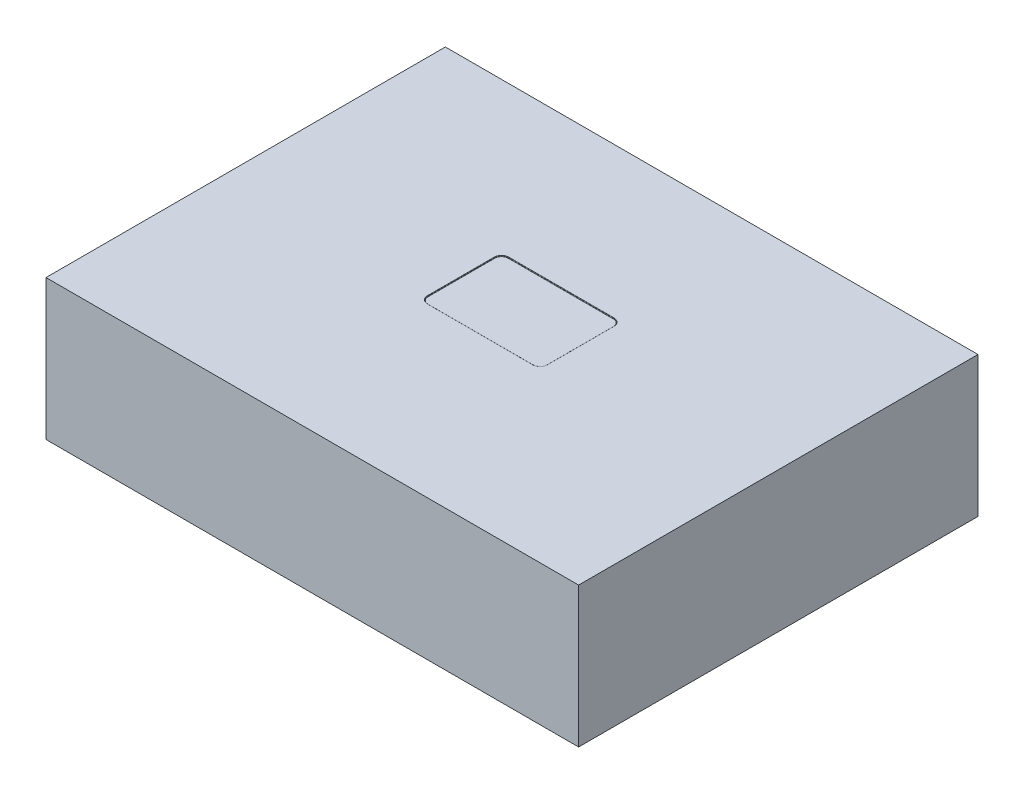
ISO-10303-21;
HEADER;
FILE_DESCRIPTION(('STEP AP214'),'2;1');
FILE_NAME('part.step','',(''),(''),'','','');
FILE_SCHEMA(('AUTOMOTIVE_DESIGN { 1 0 10303 214 1 1 1 1 }'));
ENDSEC;
DATA;
#1=APPLICATION_CONTEXT('core data for automotive mechanical design processes');
#2=APPLICATION_PROTOCOL_DEFINITION('international standard','automotive_design',2000,#1);
#3=PRODUCT_CONTEXT('',#1,'mechanical');
#4=PRODUCT('Part','Part','',(#3));
#5=PRODUCT_RELATED_PRODUCT_CATEGORY('part','',(#4));
#6=PRODUCT_DEFINITION_FORMATION('','',#4);
#7=PRODUCT_DEFINITION_CONTEXT('part definition',#1,'design');
#8=PRODUCT_DEFINITION('design','',#6,#7);
#9=PRODUCT_DEFINITION_SHAPE('','',#8);
#10=(LENGTH_UNIT() NAMED_UNIT(*) SI_UNIT(.MILLI.,.METRE.));
#11=(NAMED_UNIT(*) PLANE_ANGLE_UNIT() SI_UNIT($,.RADIAN.));
#12=(NAMED_UNIT(*) SI_UNIT($,.STERADIAN.) SOLID_ANGLE_UNIT());
#13=UNCERTAINTY_MEASURE_WITH_UNIT(LENGTH_MEASURE(1.E-05),#10,'distance_accuracy_value','');
#14=(GEOMETRIC_REPRESENTATION_CONTEXT(3) GLOBAL_UNCERTAINTY_ASSIGNED_CONTEXT((#13)) GLOBAL_UNIT_ASSIGNED_CONTEXT((#10,
#11,#12)) REPRESENTATION_CONTEXT('',''));
#15=CARTESIAN_POINT('',(0.,0.,0.));
#16=DIRECTION('',(0.,0.,1.));
#17=DIRECTION('',(1.,0.,0.));
#18=AXIS2_PLACEMENT_3D('',#15,#16,#17);
#19=CARTESIAN_POINT('',(0.,15.875,0.));
#20=DIRECTION('',(0.,1.,0.));
#21=DIRECTION('',(0.,0.,1.));
#22=AXIS2_PLACEMENT_3D('',#19,#20,#21);
#23=PLANE('',#22);
#24=DIRECTION('',(-1.,0.,0.));
#25=VECTOR('',#24,1.);
#26=CARTESIAN_POINT('',(0.,15.875,36.1578025612107));
#27=LINE('',#26,#25);
#28=CARTESIAN_POINT('',(48.2228025612107,15.875,36.1578025612107));
#29=VERTEX_POINT('',#28);
#30=CARTESIAN_POINT('',(-48.2228025612107,15.875,36.1578025612107));
#31=VERTEX_POINT('',#30);
#32=EDGE_CURVE('E156',#29,#31,#27,.T.);
#33=ORIENTED_EDGE('',*,*,#32,.F.);
#34=DIRECTION('',(0.,0.,1.));
#35=VECTOR('',#34,1.);
#36=CARTESIAN_POINT('',(48.2228025612107,15.875,0.));
#37=LINE('',#36,#35);
#38=CARTESIAN_POINT('',(48.2228025612107,15.875,-36.1578025612107));
#39=VERTEX_POINT('',#38);
#40=EDGE_CURVE('E163',#39,#29,#37,.T.);
#41=ORIENTED_EDGE('',*,*,#40,.F.);
#42=DIRECTION('',(1.,0.,0.));
#43=VECTOR('',#42,1.);
#44=CARTESIAN_POINT('',(0.,15.875,-36.1578025612107));
#45=LINE('',#44,#43);
#46=CARTESIAN_POINT('',(-48.2228025612107,15.875,-36.1578025612107));
#47=VERTEX_POINT('',#46);
#48=EDGE_CURVE('E148',#47,#39,#45,.T.);
#49=ORIENTED_EDGE('',*,*,#48,.F.);
#50=DIRECTION('',(0.,0.,-1.));
#51=VECTOR('',#50,1.);
#52=CARTESIAN_POINT('',(-48.2228025612107,15.875,0.));
#53=LINE('',#52,#51);
#54=EDGE_CURVE('E170',#31,#47,#53,.T.);
#55=ORIENTED_EDGE('',*,*,#54,.F.);
#56=EDGE_LOOP('',(#33,#41,#49,#55));
#57=FACE_BOUND('',#56,.T.);
#58=DIRECTION('',(-1.,0.,0.));
#59=VECTOR('',#58,1.);
#60=CARTESIAN_POINT('',(9.52500000000001,15.875,-8.95350000000001));
#61=LINE('',#60,#59);
#62=CARTESIAN_POINT('',(-9.52500000000001,15.875,-8.95350000000001));
#63=VERTEX_POINT('',#62);
#64=CARTESIAN_POINT('',(9.52500000000001,15.875,-8.95350000000001));
#65=VERTEX_POINT('',#64);
#66=EDGE_CURVE('E196',#63,#65,#61,.F.);
#67=ORIENTED_EDGE('',*,*,#66,.T.);
#68=CARTESIAN_POINT('',(9.52500000000001,15.875,-7.62000000000001));
#69=DIRECTION('',(0.,1.,0.));
#70=DIRECTION('',(0.,0.,1.));
#71=AXIS2_PLACEMENT_3D('',#68,#69,#70);
#72=CIRCLE('',#71,1.3335);
#73=CARTESIAN_POINT('',(10.8585,15.875,-7.62000000000001));
#74=VERTEX_POINT('',#73);
#75=EDGE_CURVE('E210',#65,#74,#72,.F.);
#76=ORIENTED_EDGE('',*,*,#75,.T.);
#77=DIRECTION('',(0.,0.,-1.));
#78=VECTOR('',#77,1.);
#79=CARTESIAN_POINT('',(10.8585,15.875,4.44499999999997));
#80=LINE('',#79,#78);
#81=CARTESIAN_POINT('',(10.8585,15.875,4.44499999999997));
#82=VERTEX_POINT('',#81);
#83=EDGE_CURVE('E208',#74,#82,#80,.F.);
#84=ORIENTED_EDGE('',*,*,#83,.T.);
#85=CARTESIAN_POINT('',(9.52500000000001,15.875,4.44499999999997));
#86=DIRECTION('',(0.,1.,0.));
#87=DIRECTION('',(0.,0.,1.));
#88=AXIS2_PLACEMENT_3D('',#85,#86,#87);
#89=CIRCLE('',#88,1.3335);
#90=CARTESIAN_POINT('',(9.52500000000001,15.875,5.77849999999997));
#91=VERTEX_POINT('',#90);
#92=EDGE_CURVE('E206',#82,#91,#89,.F.);
#93=ORIENTED_EDGE('',*,*,#92,.T.);
#94=DIRECTION('',(1.,0.,0.));
#95=VECTOR('',#94,1.);
#96=CARTESIAN_POINT('',(-9.52500000000001,15.875,5.77849999999997));
#97=LINE('',#96,#95);
#98=CARTESIAN_POINT('',(-9.52500000000001,15.875,5.77849999999997));
#99=VERTEX_POINT('',#98);
#100=EDGE_CURVE('E204',#91,#99,#97,.F.);
#101=ORIENTED_EDGE('',*,*,#100,.T.);
#102=CARTESIAN_POINT('',(-9.52500000000001,15.875,4.44499999999997));
#103=DIRECTION('',(0.,1.,0.));
#104=DIRECTION('',(0.,0.,1.));
#105=AXIS2_PLACEMENT_3D('',#102,#103,#104);
#106=CIRCLE('',#105,1.3335);
#107=CARTESIAN_POINT('',(-10.8585,15.875,4.44499999999997));
#108=VERTEX_POINT('',#107);
#109=EDGE_CURVE('E202',#99,#108,#106,.F.);
#110=ORIENTED_EDGE('',*,*,#109,.T.);
#111=DIRECTION('',(0.,0.,1.));
#112=VECTOR('',#111,1.);
#113=CARTESIAN_POINT('',(-10.8585,15.875,-7.62000000000001));
#114=LINE('',#113,#112);
#115=CARTESIAN_POINT('',(-10.8585,15.875,-7.62000000000001));
#116=VERTEX_POINT('',#115);
#117=EDGE_CURVE('E200',#108,#116,#114,.F.);
#118=ORIENTED_EDGE('',*,*,#117,.T.);
#119=CARTESIAN_POINT('',(-9.52500000000001,15.875,-7.62000000000001));
#120=DIRECTION('',(0.,1.,0.));
#121=DIRECTION('',(0.,0.,1.));
#122=AXIS2_PLACEMENT_3D('',#119,#120,#121);
#123=CIRCLE('',#122,1.3335);
#124=EDGE_CURVE('E198',#116,#63,#123,.F.);
#125=ORIENTED_EDGE('',*,*,#124,.T.);
#126=EDGE_LOOP('',(#67,#76,#84,#93,#101,#110,#118,#125));
#127=FACE_BOUND('',#126,.T.);
#128=ADVANCED_FACE('F38',(#57,#127),#23,.T.);
#129=CARTESIAN_POINT('',(0.,15.748,0.));
#130=DIRECTION('',(0.,1.,0.));
#131=DIRECTION('',(0.,0.,1.));
#132=AXIS2_PLACEMENT_3D('',#129,#130,#131);
#133=PLANE('',#132);
#134=DIRECTION('',(0.,0.,-1.));
#135=VECTOR('',#134,1.);
#136=CARTESIAN_POINT('',(10.7315,15.748,0.));
#137=LINE('',#136,#135);
#138=CARTESIAN_POINT('',(10.7315,15.748,4.44499999999997));
#139=VERTEX_POINT('',#138);
#140=CARTESIAN_POINT('',(10.7315,15.748,-7.62000000000001));
#141=VERTEX_POINT('',#140);
#142=EDGE_CURVE('E191',#139,#141,#137,.T.);
#143=ORIENTED_EDGE('',*,*,#142,.T.);
#144=CARTESIAN_POINT('',(9.52500000000001,15.748,-7.62000000000001));
#145=DIRECTION('',(0.,1.,0.));
#146=DIRECTION('',(0.,0.,1.));
#147=AXIS2_PLACEMENT_3D('',#144,#145,#146);
#148=CIRCLE('',#147,1.2065);
#149=CARTESIAN_POINT('',(9.52500000000001,15.748,-8.82650000000001));
#150=VERTEX_POINT('',#149);
#151=EDGE_CURVE('E193',#141,#150,#148,.T.);
#152=ORIENTED_EDGE('',*,*,#151,.T.);
#153=DIRECTION('',(-1.,0.,0.));
#154=VECTOR('',#153,1.);
#155=CARTESIAN_POINT('',(0.,15.748,-8.82650000000001));
#156=LINE('',#155,#154);
#157=CARTESIAN_POINT('',(-9.52500000000001,15.748,-8.82650000000001));
#158=VERTEX_POINT('',#157);
#159=EDGE_CURVE('E178',#150,#158,#156,.T.);
#160=ORIENTED_EDGE('',*,*,#159,.T.);
#161=CARTESIAN_POINT('',(-9.52500000000001,15.748,-7.62000000000001));
#162=DIRECTION('',(0.,1.,0.));
#163=DIRECTION('',(0.,0.,1.));
#164=AXIS2_PLACEMENT_3D('',#161,#162,#163);
#165=CIRCLE('',#164,1.2065);
#166=CARTESIAN_POINT('',(-10.7315,15.748,-7.62000000000001));
#167=VERTEX_POINT('',#166);
#168=EDGE_CURVE('E180',#158,#167,#165,.T.);
#169=ORIENTED_EDGE('',*,*,#168,.T.);
#170=DIRECTION('',(0.,0.,1.));
#171=VECTOR('',#170,1.);
#172=CARTESIAN_POINT('',(-10.7315,15.748,0.));
#173=LINE('',#172,#171);
#174=CARTESIAN_POINT('',(-10.7315,15.748,4.44499999999997));
#175=VERTEX_POINT('',#174);
#176=EDGE_CURVE('E183',#167,#175,#173,.T.);
#177=ORIENTED_EDGE('',*,*,#176,.T.);
#178=CARTESIAN_POINT('',(-9.52500000000001,15.748,4.44499999999997));
#179=DIRECTION('',(0.,1.,0.));
#180=DIRECTION('',(0.,0.,1.));
#181=AXIS2_PLACEMENT_3D('',#178,#179,#180);
#182=CIRCLE('',#181,1.2065);
#183=CARTESIAN_POINT('',(-9.52500000000001,15.748,5.65149999999997));
#184=VERTEX_POINT('',#183);
#185=EDGE_CURVE('E185',#175,#184,#182,.T.);
#186=ORIENTED_EDGE('',*,*,#185,.T.);
#187=DIRECTION('',(1.,0.,0.));
#188=VECTOR('',#187,1.);
#189=CARTESIAN_POINT('',(0.,15.748,5.65149999999997));
#190=LINE('',#189,#188);
#191=CARTESIAN_POINT('',(9.52500000000001,15.748,5.65149999999997));
#192=VERTEX_POINT('',#191);
#193=EDGE_CURVE('E187',#184,#192,#190,.T.);
#194=ORIENTED_EDGE('',*,*,#193,.T.);
#195=CARTESIAN_POINT('',(9.52500000000001,15.748,4.44499999999997));
#196=DIRECTION('',(0.,1.,0.));
#197=DIRECTION('',(0.,0.,1.));
#198=AXIS2_PLACEMENT_3D('',#195,#196,#197);
#199=CIRCLE('',#198,1.2065);
#200=EDGE_CURVE('E189',#192,#139,#199,.T.);
#201=ORIENTED_EDGE('',*,*,#200,.T.);
#202=EDGE_LOOP('',(#143,#152,#160,#169,#177,#186,#194,#201));
#203=FACE_BOUND('',#202,.T.);
#204=ADVANCED_FACE('F297',(#203),#133,.T.);
#205=CARTESIAN_POINT('',(-9.52500000000001,15.8115,4.44499999999997));
#206=DIRECTION('',(0.,1.,0.));
#207=DIRECTION('',(0.,0.,1.));
#208=AXIS2_PLACEMENT_3D('',#205,#206,#207);
#209=TOROIDAL_SURFACE('',#208,1.3335,0.0635);
#210=CARTESIAN_POINT('',(-10.8585,15.8115,4.44499999999997));
#211=DIRECTION('',(0.,0.,-1.));
#212=DIRECTION('',(-1.,0.,0.));
#213=AXIS2_PLACEMENT_3D('',#210,#211,#212);
#214=CIRCLE('',#213,0.0635);
#215=CARTESIAN_POINT('',(-10.795,15.8115,4.44499999999997));
#216=VERTEX_POINT('',#215);
#217=EDGE_CURVE('E270',#108,#216,#214,.T.);
#218=ORIENTED_EDGE('',*,*,#217,.F.);
#219=ORIENTED_EDGE('',*,*,#109,.F.);
#220=CARTESIAN_POINT('',(-9.52500000000001,15.8115,5.77849999999997));
#221=DIRECTION('',(1.,0.,0.));
#222=DIRECTION('',(0.,0.,-1.));
#223=AXIS2_PLACEMENT_3D('',#220,#221,#222);
#224=CIRCLE('',#223,0.0635);
#225=CARTESIAN_POINT('',(-9.52500000000001,15.8115,5.71499999999997));
#226=VERTEX_POINT('',#225);
#227=EDGE_CURVE('E181',#226,#99,#224,.T.);
#228=ORIENTED_EDGE('',*,*,#227,.F.);
#229=CARTESIAN_POINT('',(-9.52500000000001,15.8115,4.44499999999997));
#230=DIRECTION('',(0.,1.,0.));
#231=DIRECTION('',(0.,0.,1.));
#232=AXIS2_PLACEMENT_3D('',#229,#230,#231);
#233=CIRCLE('',#232,1.27);
#234=EDGE_CURVE('E273',#216,#226,#233,.T.);
#235=ORIENTED_EDGE('',*,*,#234,.F.);
#236=EDGE_LOOP('',(#218,#219,#228,#235));
#237=FACE_BOUND('',#236,.T.);
#238=ADVANCED_FACE('F40',(#237),#209,.T.);
#239=CARTESIAN_POINT('',(10.795,15.8115,5.77849999999997));
#240=DIRECTION('',(-1.,0.,0.));
#241=DIRECTION('',(0.,0.,1.));
#242=AXIS2_PLACEMENT_3D('',#239,#240,#241);
#243=CYLINDRICAL_SURFACE('',#242,0.0635);
#244=ORIENTED_EDGE('',*,*,#227,.T.);
#245=ORIENTED_EDGE('',*,*,#100,.F.);
#246=CARTESIAN_POINT('',(9.52500000000001,15.8115,5.77849999999997));
#247=DIRECTION('',(1.,0.,0.));
#248=DIRECTION('',(0.,0.,-1.));
#249=AXIS2_PLACEMENT_3D('',#246,#247,#248);
#250=CIRCLE('',#249,0.0635);
#251=CARTESIAN_POINT('',(9.52500000000001,15.8115,5.71499999999997));
#252=VERTEX_POINT('',#251);
#253=EDGE_CURVE('E267',#252,#91,#250,.T.);
#254=ORIENTED_EDGE('',*,*,#253,.F.);
#255=DIRECTION('',(1.,0.,0.));
#256=VECTOR('',#255,1.);
#257=CARTESIAN_POINT('',(9.52500000000001,15.8115,5.71499999999997));
#258=LINE('',#257,#256);
#259=EDGE_CURVE('E264',#226,#252,#258,.T.);
#260=ORIENTED_EDGE('',*,*,#259,.F.);
#261=EDGE_LOOP('',(#244,#245,#254,#260));
#262=FACE_BOUND('',#261,.T.);
#263=ADVANCED_FACE('F362',(#262),#243,.T.);
#264=CARTESIAN_POINT('',(-9.52500000000001,15.8115,4.44499999999997));
#265=DIRECTION('',(0.,1.,0.));
#266=DIRECTION('',(0.,0.,1.));
#267=AXIS2_PLACEMENT_3D('',#264,#265,#266);
#268=TOROIDAL_SURFACE('',#267,1.2065,0.0635);
#269=CARTESIAN_POINT('',(-10.7315,15.8115,4.44499999999997));
#270=DIRECTION('',(0.,0.,1.));
#271=DIRECTION('',(1.,0.,0.));
#272=AXIS2_PLACEMENT_3D('',#269,#270,#271);
#273=CIRCLE('',#272,0.0635);
#274=EDGE_CURVE('E258',#216,#175,#273,.T.);
#275=ORIENTED_EDGE('',*,*,#274,.F.);
#276=ORIENTED_EDGE('',*,*,#234,.T.);
#277=CARTESIAN_POINT('',(-9.52500000000001,15.8115,5.65149999999997));
#278=DIRECTION('',(-1.,0.,0.));
#279=DIRECTION('',(0.,0.,1.));
#280=AXIS2_PLACEMENT_3D('',#277,#278,#279);
#281=CIRCLE('',#280,0.0635);
#282=EDGE_CURVE('E261',#184,#226,#281,.T.);
#283=ORIENTED_EDGE('',*,*,#282,.F.);
#284=ORIENTED_EDGE('',*,*,#185,.F.);
#285=EDGE_LOOP('',(#275,#276,#283,#284));
#286=FACE_BOUND('',#285,.T.);
#287=ADVANCED_FACE('F359',(#286),#268,.F.);
#288=CARTESIAN_POINT('',(-10.8585,15.8115,5.71499999999997));
#289=DIRECTION('',(0.,0.,-1.));
#290=DIRECTION('',(-1.,0.,0.));
#291=AXIS2_PLACEMENT_3D('',#288,#289,#290);
#292=CYLINDRICAL_SURFACE('',#291,0.0635);
#293=ORIENTED_EDGE('',*,*,#117,.F.);
#294=ORIENTED_EDGE('',*,*,#217,.T.);
#295=DIRECTION('',(0.,0.,1.));
#296=VECTOR('',#295,1.);
#297=CARTESIAN_POINT('',(-10.795,15.8115,4.44499999999997));
#298=LINE('',#297,#296);
#299=CARTESIAN_POINT('',(-10.795,15.8115,-7.62000000000001));
#300=VERTEX_POINT('',#299);
#301=EDGE_CURVE('E255',#300,#216,#298,.T.);
#302=ORIENTED_EDGE('',*,*,#301,.F.);
#303=CARTESIAN_POINT('',(-10.8585,15.8115,-7.62000000000001));
#304=DIRECTION('',(0.,0.,-1.));
#305=DIRECTION('',(-1.,0.,0.));
#306=AXIS2_PLACEMENT_3D('',#303,#304,#305);
#307=CIRCLE('',#306,0.0635);
#308=EDGE_CURVE('E252',#116,#300,#307,.T.);
#309=ORIENTED_EDGE('',*,*,#308,.F.);
#310=EDGE_LOOP('',(#293,#294,#302,#309));
#311=FACE_BOUND('',#310,.T.);
#312=ADVANCED_FACE('F355',(#311),#292,.T.);
#313=CARTESIAN_POINT('',(9.52500000000001,15.8115,4.44499999999997));
#314=DIRECTION('',(0.,1.,0.));
#315=DIRECTION('',(0.,0.,1.));
#316=AXIS2_PLACEMENT_3D('',#313,#314,#315);
#317=TOROIDAL_SURFACE('',#316,1.3335,0.0635);
#318=ORIENTED_EDGE('',*,*,#253,.T.);
#319=ORIENTED_EDGE('',*,*,#92,.F.);
#320=CARTESIAN_POINT('',(10.8585,15.8115,4.44499999999997));
#321=DIRECTION('',(0.,0.,-1.));
#322=DIRECTION('',(-1.,0.,0.));
#323=AXIS2_PLACEMENT_3D('',#320,#321,#322);
#324=CIRCLE('',#323,0.0635);
#325=CARTESIAN_POINT('',(10.795,15.8115,4.44499999999997));
#326=VERTEX_POINT('',#325);
#327=EDGE_CURVE('E249',#326,#82,#324,.T.);
#328=ORIENTED_EDGE('',*,*,#327,.F.);
#329=CARTESIAN_POINT('',(9.52500000000001,15.8115,4.44499999999997));
#330=DIRECTION('',(0.,1.,0.));
#331=DIRECTION('',(0.,0.,1.));
#332=AXIS2_PLACEMENT_3D('',#329,#330,#331);
#333=CIRCLE('',#332,1.27);
#334=EDGE_CURVE('E246',#252,#326,#333,.T.);
#335=ORIENTED_EDGE('',*,*,#334,.F.);
#336=EDGE_LOOP('',(#318,#319,#328,#335));
#337=FACE_BOUND('',#336,.T.);
#338=ADVANCED_FACE('F351',(#337),#317,.T.);
#339=CARTESIAN_POINT('',(0.,15.8115,5.65149999999997));
#340=DIRECTION('',(1.,0.,0.));
#341=DIRECTION('',(0.,0.,-1.));
#342=AXIS2_PLACEMENT_3D('',#339,#340,#341);
#343=CYLINDRICAL_SURFACE('',#342,0.0635);
#344=ORIENTED_EDGE('',*,*,#282,.T.);
#345=ORIENTED_EDGE('',*,*,#259,.T.);
#346=CARTESIAN_POINT('',(9.52500000000001,15.8115,5.65149999999997));
#347=DIRECTION('',(-1.,0.,0.));
#348=DIRECTION('',(0.,0.,1.));
#349=AXIS2_PLACEMENT_3D('',#346,#347,#348);
#350=CIRCLE('',#349,0.0635);
#351=EDGE_CURVE('E243',#192,#252,#350,.T.);
#352=ORIENTED_EDGE('',*,*,#351,.F.);
#353=ORIENTED_EDGE('',*,*,#193,.F.);
#354=EDGE_LOOP('',(#344,#345,#352,#353));
#355=FACE_BOUND('',#354,.T.);
#356=ADVANCED_FACE('F347',(#355),#343,.F.);
#357=CARTESIAN_POINT('',(-10.7315,15.8115,0.));
#358=DIRECTION('',(0.,0.,1.));
#359=DIRECTION('',(1.,0.,0.));
#360=AXIS2_PLACEMENT_3D('',#357,#358,#359);
#361=CYLINDRICAL_SURFACE('',#360,0.0635);
#362=ORIENTED_EDGE('',*,*,#274,.T.);
#363=ORIENTED_EDGE('',*,*,#176,.F.);
#364=CARTESIAN_POINT('',(-10.7315,15.8115,-7.62000000000001));
#365=DIRECTION('',(0.,0.,1.));
#366=DIRECTION('',(1.,0.,0.));
#367=AXIS2_PLACEMENT_3D('',#364,#365,#366);
#368=CIRCLE('',#367,0.0635);
#369=EDGE_CURVE('E240',#300,#167,#368,.T.);
#370=ORIENTED_EDGE('',*,*,#369,.F.);
#371=ORIENTED_EDGE('',*,*,#301,.T.);
#372=EDGE_LOOP('',(#362,#363,#370,#371));
#373=FACE_BOUND('',#372,.T.);
#374=ADVANCED_FACE('F343',(#373),#361,.F.);
#375=CARTESIAN_POINT('',(-9.52500000000001,15.8115,-7.62000000000001));
#376=DIRECTION('',(0.,1.,0.));
#377=DIRECTION('',(0.,0.,1.));
#378=AXIS2_PLACEMENT_3D('',#375,#376,#377);
#379=TOROIDAL_SURFACE('',#378,1.3335,0.0635);
#380=ORIENTED_EDGE('',*,*,#124,.F.);
#381=ORIENTED_EDGE('',*,*,#308,.T.);
#382=CARTESIAN_POINT('',(-9.52500000000001,15.8115,-7.62000000000001));
#383=DIRECTION('',(0.,1.,0.));
#384=DIRECTION('',(0.,0.,1.));
#385=AXIS2_PLACEMENT_3D('',#382,#383,#384);
#386=CIRCLE('',#385,1.27);
#387=CARTESIAN_POINT('',(-9.52500000000001,15.8115,-8.89000000000001));
#388=VERTEX_POINT('',#387);
#389=EDGE_CURVE('E237',#388,#300,#386,.T.);
#390=ORIENTED_EDGE('',*,*,#389,.F.);
#391=CARTESIAN_POINT('',(-9.52500000000001,15.8115,-8.95350000000001));
#392=DIRECTION('',(1.,0.,0.));
#393=DIRECTION('',(0.,0.,-1.));
#394=AXIS2_PLACEMENT_3D('',#391,#392,#393);
#395=CIRCLE('',#394,0.0635);
#396=EDGE_CURVE('E234',#63,#388,#395,.T.);
#397=ORIENTED_EDGE('',*,*,#396,.F.);
#398=EDGE_LOOP('',(#380,#381,#390,#397));
#399=FACE_BOUND('',#398,.T.);
#400=ADVANCED_FACE('F339',(#399),#379,.T.);
#401=CARTESIAN_POINT('',(10.8585,15.8115,5.71499999999997));
#402=DIRECTION('',(0.,0.,1.));
#403=DIRECTION('',(1.,0.,0.));
#404=AXIS2_PLACEMENT_3D('',#401,#402,#403);
#405=CYLINDRICAL_SURFACE('',#404,0.0635);
#406=ORIENTED_EDGE('',*,*,#327,.T.);
#407=ORIENTED_EDGE('',*,*,#83,.F.);
#408=CARTESIAN_POINT('',(10.8585,15.8115,-7.62000000000001));
#409=DIRECTION('',(0.,0.,-1.));
#410=DIRECTION('',(-1.,0.,0.));
#411=AXIS2_PLACEMENT_3D('',#408,#409,#410);
#412=CIRCLE('',#411,0.0635);
#413=CARTESIAN_POINT('',(10.795,15.8115,-7.62000000000001));
#414=VERTEX_POINT('',#413);
#415=EDGE_CURVE('E230',#414,#74,#412,.T.);
#416=ORIENTED_EDGE('',*,*,#415,.F.);
#417=DIRECTION('',(0.,0.,-1.));
#418=VECTOR('',#417,1.);
#419=CARTESIAN_POINT('',(10.795,15.8115,-7.62000000000001));
#420=LINE('',#419,#418);
#421=EDGE_CURVE('E227',#326,#414,#420,.T.);
#422=ORIENTED_EDGE('',*,*,#421,.F.);
#423=EDGE_LOOP('',(#406,#407,#416,#422));
#424=FACE_BOUND('',#423,.T.);
#425=ADVANCED_FACE('F335',(#424),#405,.T.);
#426=CARTESIAN_POINT('',(9.52500000000001,15.8115,4.44499999999997));
#427=DIRECTION('',(0.,1.,0.));
#428=DIRECTION('',(0.,0.,1.));
#429=AXIS2_PLACEMENT_3D('',#426,#427,#428);
#430=TOROIDAL_SURFACE('',#429,1.2065,0.0635);
#431=ORIENTED_EDGE('',*,*,#351,.T.);
#432=ORIENTED_EDGE('',*,*,#334,.T.);
#433=CARTESIAN_POINT('',(10.7315,15.8115,4.44499999999997));
#434=DIRECTION('',(0.,0.,1.));
#435=DIRECTION('',(1.,0.,0.));
#436=AXIS2_PLACEMENT_3D('',#433,#434,#435);
#437=CIRCLE('',#436,0.0635);
#438=EDGE_CURVE('E224',#139,#326,#437,.T.);
#439=ORIENTED_EDGE('',*,*,#438,.F.);
#440=ORIENTED_EDGE('',*,*,#200,.F.);
#441=EDGE_LOOP('',(#431,#432,#439,#440));
#442=FACE_BOUND('',#441,.T.);
#443=ADVANCED_FACE('F331',(#442),#430,.F.);
#444=CARTESIAN_POINT('',(-9.52500000000001,15.8115,-7.62000000000001));
#445=DIRECTION('',(0.,1.,0.));
#446=DIRECTION('',(0.,0.,1.));
#447=AXIS2_PLACEMENT_3D('',#444,#445,#446);
#448=TOROIDAL_SURFACE('',#447,1.2065,0.0635);
#449=ORIENTED_EDGE('',*,*,#369,.T.);
#450=ORIENTED_EDGE('',*,*,#168,.F.);
#451=CARTESIAN_POINT('',(-9.52500000000001,15.8115,-8.82650000000001));
#452=DIRECTION('',(-1.,0.,0.));
#453=DIRECTION('',(0.,0.,1.));
#454=AXIS2_PLACEMENT_3D('',#451,#452,#453);
#455=CIRCLE('',#454,0.0635);
#456=EDGE_CURVE('E221',#388,#158,#455,.T.);
#457=ORIENTED_EDGE('',*,*,#456,.F.);
#458=ORIENTED_EDGE('',*,*,#389,.T.);
#459=EDGE_LOOP('',(#449,#450,#457,#458));
#460=FACE_BOUND('',#459,.T.);
#461=ADVANCED_FACE('F327',(#460),#448,.F.);
#462=CARTESIAN_POINT('',(10.795,15.8115,-8.95350000000001));
#463=DIRECTION('',(1.,0.,0.));
#464=DIRECTION('',(0.,0.,-1.));
#465=AXIS2_PLACEMENT_3D('',#462,#463,#464);
#466=CYLINDRICAL_SURFACE('',#465,0.0635);
#467=CARTESIAN_POINT('',(9.52500000000001,15.8115,-8.95350000000001));
#468=DIRECTION('',(1.,0.,0.));
#469=DIRECTION('',(0.,0.,-1.));
#470=AXIS2_PLACEMENT_3D('',#467,#468,#469);
#471=CIRCLE('',#470,0.0635);
#472=CARTESIAN_POINT('',(9.52500000000001,15.8115,-8.89000000000001));
#473=VERTEX_POINT('',#472);
#474=EDGE_CURVE('E232',#65,#473,#471,.T.);
#475=ORIENTED_EDGE('',*,*,#474,.F.);
#476=ORIENTED_EDGE('',*,*,#66,.F.);
#477=ORIENTED_EDGE('',*,*,#396,.T.);
#478=DIRECTION('',(-1.,0.,0.));
#479=VECTOR('',#478,1.);
#480=CARTESIAN_POINT('',(-9.52500000000001,15.8115,-8.89000000000001));
#481=LINE('',#480,#479);
#482=EDGE_CURVE('E218',#473,#388,#481,.T.);
#483=ORIENTED_EDGE('',*,*,#482,.F.);
#484=EDGE_LOOP('',(#475,#476,#477,#483));
#485=FACE_BOUND('',#484,.T.);
#486=ADVANCED_FACE('F323',(#485),#466,.T.);
#487=CARTESIAN_POINT('',(9.52500000000001,15.8115,-7.62000000000001));
#488=DIRECTION('',(0.,1.,0.));
#489=DIRECTION('',(0.,0.,1.));
#490=AXIS2_PLACEMENT_3D('',#487,#488,#489);
#491=TOROIDAL_SURFACE('',#490,1.3335,0.0635);
#492=ORIENTED_EDGE('',*,*,#75,.F.);
#493=ORIENTED_EDGE('',*,*,#474,.T.);
#494=CARTESIAN_POINT('',(9.52500000000001,15.8115,-7.62000000000001));
#495=DIRECTION('',(0.,1.,0.));
#496=DIRECTION('',(0.,0.,1.));
#497=AXIS2_PLACEMENT_3D('',#494,#495,#496);
#498=CIRCLE('',#497,1.27);
#499=EDGE_CURVE('E215',#414,#473,#498,.T.);
#500=ORIENTED_EDGE('',*,*,#499,.F.);
#501=ORIENTED_EDGE('',*,*,#415,.T.);
#502=EDGE_LOOP('',(#492,#493,#500,#501));
#503=FACE_BOUND('',#502,.T.);
#504=ADVANCED_FACE('F319',(#503),#491,.T.);
#505=CARTESIAN_POINT('',(10.7315,15.8115,0.));
#506=DIRECTION('',(0.,0.,-1.));
#507=DIRECTION('',(-1.,0.,0.));
#508=AXIS2_PLACEMENT_3D('',#505,#506,#507);
#509=CYLINDRICAL_SURFACE('',#508,0.0635);
#510=ORIENTED_EDGE('',*,*,#438,.T.);
#511=ORIENTED_EDGE('',*,*,#421,.T.);
#512=CARTESIAN_POINT('',(10.7315,15.8115,-7.62000000000001));
#513=DIRECTION('',(0.,0.,1.));
#514=DIRECTION('',(1.,0.,0.));
#515=AXIS2_PLACEMENT_3D('',#512,#513,#514);
#516=CIRCLE('',#515,0.0635);
#517=EDGE_CURVE('E172',#141,#414,#516,.T.);
#518=ORIENTED_EDGE('',*,*,#517,.F.);
#519=ORIENTED_EDGE('',*,*,#142,.F.);
#520=EDGE_LOOP('',(#510,#511,#518,#519));
#521=FACE_BOUND('',#520,.T.);
#522=ADVANCED_FACE('F315',(#521),#509,.F.);
#523=CARTESIAN_POINT('',(0.,15.8115,-8.82650000000001));
#524=DIRECTION('',(-1.,0.,0.));
#525=DIRECTION('',(0.,0.,1.));
#526=AXIS2_PLACEMENT_3D('',#523,#524,#525);
#527=CYLINDRICAL_SURFACE('',#526,0.0635);
#528=ORIENTED_EDGE('',*,*,#456,.T.);
#529=ORIENTED_EDGE('',*,*,#159,.F.);
#530=CARTESIAN_POINT('',(9.52500000000001,15.8115,-8.82650000000001));
#531=DIRECTION('',(-1.,0.,0.));
#532=DIRECTION('',(0.,0.,1.));
#533=AXIS2_PLACEMENT_3D('',#530,#531,#532);
#534=CIRCLE('',#533,0.0635);
#535=EDGE_CURVE('E169',#473,#150,#534,.T.);
#536=ORIENTED_EDGE('',*,*,#535,.F.);
#537=ORIENTED_EDGE('',*,*,#482,.T.);
#538=EDGE_LOOP('',(#528,#529,#536,#537));
#539=FACE_BOUND('',#538,.T.);
#540=ADVANCED_FACE('F311',(#539),#527,.F.);
#541=CARTESIAN_POINT('',(9.52500000000001,15.8115,-7.62000000000001));
#542=DIRECTION('',(0.,1.,0.));
#543=DIRECTION('',(0.,0.,1.));
#544=AXIS2_PLACEMENT_3D('',#541,#542,#543);
#545=TOROIDAL_SURFACE('',#544,1.2065,0.0635);
#546=ORIENTED_EDGE('',*,*,#517,.T.);
#547=ORIENTED_EDGE('',*,*,#499,.T.);
#548=ORIENTED_EDGE('',*,*,#535,.T.);
#549=ORIENTED_EDGE('',*,*,#151,.F.);
#550=EDGE_LOOP('',(#546,#547,#548,#549));
#551=FACE_BOUND('',#550,.T.);
#552=ADVANCED_FACE('F308',(#551),#545,.F.);
#553=CARTESIAN_POINT('',(-48.2228025612107,16.8493243481018,-56.4778025612107));
#554=DIRECTION('',(1.,0.,0.));
#555=DIRECTION('',(0.,1.,0.));
#556=AXIS2_PLACEMENT_3D('',#553,#554,#555);
#557=PLANE('',#556);
#558=DIRECTION('',(0.,0.,1.));
#559=VECTOR('',#558,1.);
#560=CARTESIAN_POINT('',(-48.2228025612107,-9.525,56.4778025612107));
#561=LINE('',#560,#559);
#562=CARTESIAN_POINT('',(-48.2228025612107,-9.525,-36.1578025612107));
#563=VERTEX_POINT('',#562);
#564=CARTESIAN_POINT('',(-48.2228025612107,-9.525,36.1578025612107));
#565=VERTEX_POINT('',#564);
#566=EDGE_CURVE('E174',#563,#565,#561,.T.);
#567=ORIENTED_EDGE('',*,*,#566,.T.);
#568=DIRECTION('',(0.,1.,0.));
#569=VECTOR('',#568,1.);
#570=CARTESIAN_POINT('',(-48.2228025612107,-9.66583641843844,36.1578025612107));
#571=LINE('',#570,#569);
#572=EDGE_CURVE('E61',#565,#31,#571,.T.);
#573=ORIENTED_EDGE('',*,*,#572,.T.);
#574=ORIENTED_EDGE('',*,*,#54,.T.);
#575=DIRECTION('',(0.,-1.,0.));
#576=VECTOR('',#575,1.);
#577=CARTESIAN_POINT('',(-48.2228025612107,-11.4302261553231,-36.1578025612107));
#578=LINE('',#577,#576);
#579=EDGE_CURVE('E151',#47,#563,#578,.T.);
#580=ORIENTED_EDGE('',*,*,#579,.T.);
#581=EDGE_LOOP('',(#567,#573,#574,#580));
#582=FACE_BOUND('',#581,.T.);
#583=ADVANCED_FACE('F283',(#582),#557,.F.);
#584=CARTESIAN_POINT('',(48.2228025612107,16.8493243481018,-56.4778025612107));
#585=DIRECTION('',(-1.,0.,0.));
#586=DIRECTION('',(0.,-1.,0.));
#587=AXIS2_PLACEMENT_3D('',#584,#585,#586);
#588=PLANE('',#587);
#589=ORIENTED_EDGE('',*,*,#40,.T.);
#590=DIRECTION('',(0.,1.,0.));
#591=VECTOR('',#590,1.);
#592=CARTESIAN_POINT('',(48.2228025612107,-9.66583641843844,36.1578025612107));
#593=LINE('',#592,#591);
#594=CARTESIAN_POINT('',(48.2228025612107,-9.525,36.1578025612107));
#595=VERTEX_POINT('',#594);
#596=EDGE_CURVE('E284',#595,#29,#593,.T.);
#597=ORIENTED_EDGE('',*,*,#596,.F.);
#598=DIRECTION('',(0.,0.,-1.));
#599=VECTOR('',#598,1.);
#600=CARTESIAN_POINT('',(48.2228025612107,-9.525,-56.4778025612107));
#601=LINE('',#600,#599);
#602=CARTESIAN_POINT('',(48.2228025612107,-9.525,-36.1578025612107));
#603=VERTEX_POINT('',#602);
#604=EDGE_CURVE('E165',#595,#603,#601,.T.);
#605=ORIENTED_EDGE('',*,*,#604,.T.);
#606=DIRECTION('',(0.,-1.,0.));
#607=VECTOR('',#606,1.);
#608=CARTESIAN_POINT('',(48.2228025612107,-11.4302261553231,-36.1578025612107));
#609=LINE('',#608,#607);
#610=EDGE_CURVE('E53',#39,#603,#609,.T.);
#611=ORIENTED_EDGE('',*,*,#610,.F.);
#612=EDGE_LOOP('',(#589,#597,#605,#611));
#613=FACE_BOUND('',#612,.T.);
#614=ADVANCED_FACE('F161',(#613),#588,.F.);
#615=CARTESIAN_POINT('',(-48.2228025612107,-9.525,56.4778025612107));
#616=DIRECTION('',(0.,1.,0.));
#617=DIRECTION('',(0.,0.,1.));
#618=AXIS2_PLACEMENT_3D('',#615,#616,#617);
#619=PLANE('',#618);
#620=ORIENTED_EDGE('',*,*,#604,.F.);
#621=DIRECTION('',(-1.,0.,0.));
#622=VECTOR('',#621,1.);
#623=CARTESIAN_POINT('',(-48.2228025612107,-9.525,36.1578025612107));
#624=LINE('',#623,#622);
#625=EDGE_CURVE('E13',#595,#565,#624,.T.);
#626=ORIENTED_EDGE('',*,*,#625,.T.);
#627=ORIENTED_EDGE('',*,*,#566,.F.);
#628=DIRECTION('',(1.,0.,0.));
#629=VECTOR('',#628,1.);
#630=CARTESIAN_POINT('',(-48.2228025612107,-9.525,-36.1578025612107));
#631=LINE('',#630,#629);
#632=EDGE_CURVE('E46',#563,#603,#631,.T.);
#633=ORIENTED_EDGE('',*,*,#632,.T.);
#634=EDGE_LOOP('',(#620,#626,#627,#633));
#635=FACE_BOUND('',#634,.T.);
#636=ADVANCED_FACE('F280',(#635),#619,.F.);
#637=CARTESIAN_POINT('',(-48.2228025612107,-11.4302261553231,-36.1578025612107));
#638=DIRECTION('',(0.,0.,1.));
#639=DIRECTION('',(1.,0.,0.));
#640=AXIS2_PLACEMENT_3D('',#637,#638,#639);
#641=PLANE('',#640);
#642=ORIENTED_EDGE('',*,*,#48,.T.);
#643=ORIENTED_EDGE('',*,*,#610,.T.);
#644=ORIENTED_EDGE('',*,*,#632,.F.);
#645=ORIENTED_EDGE('',*,*,#579,.F.);
#646=EDGE_LOOP('',(#642,#643,#644,#645));
#647=FACE_BOUND('',#646,.T.);
#648=ADVANCED_FACE('F149',(#647),#641,.F.);
#649=CARTESIAN_POINT('',(-48.2228025612107,-9.66583641843844,36.1578025612107));
#650=DIRECTION('',(0.,0.,-1.));
#651=DIRECTION('',(-1.,0.,0.));
#652=AXIS2_PLACEMENT_3D('',#649,#650,#651);
#653=PLANE('',#652);
#654=ORIENTED_EDGE('',*,*,#32,.T.);
#655=ORIENTED_EDGE('',*,*,#572,.F.);
#656=ORIENTED_EDGE('',*,*,#625,.F.);
#657=ORIENTED_EDGE('',*,*,#596,.T.);
#658=EDGE_LOOP('',(#654,#655,#656,#657));
#659=FACE_BOUND('',#658,.T.);
#660=ADVANCED_FACE('F289',(#659),#653,.F.);
#661=CLOSED_SHELL('',(#128,#204,#238,#263,#287,#312,#338,#356,#374,#400,#425,#443,#461,#486,
#504,#522,#540,#552,#583,#614,#636,#648,#660));
#662=MANIFOLD_SOLID_BREP('B2',#661);
#663=ADVANCED_BREP_SHAPE_REPRESENTATION('',(#18,#662),#14);
#664=SHAPE_DEFINITION_REPRESENTATION(#9,#663);
ENDSEC;
END-ISO-10303-21;
